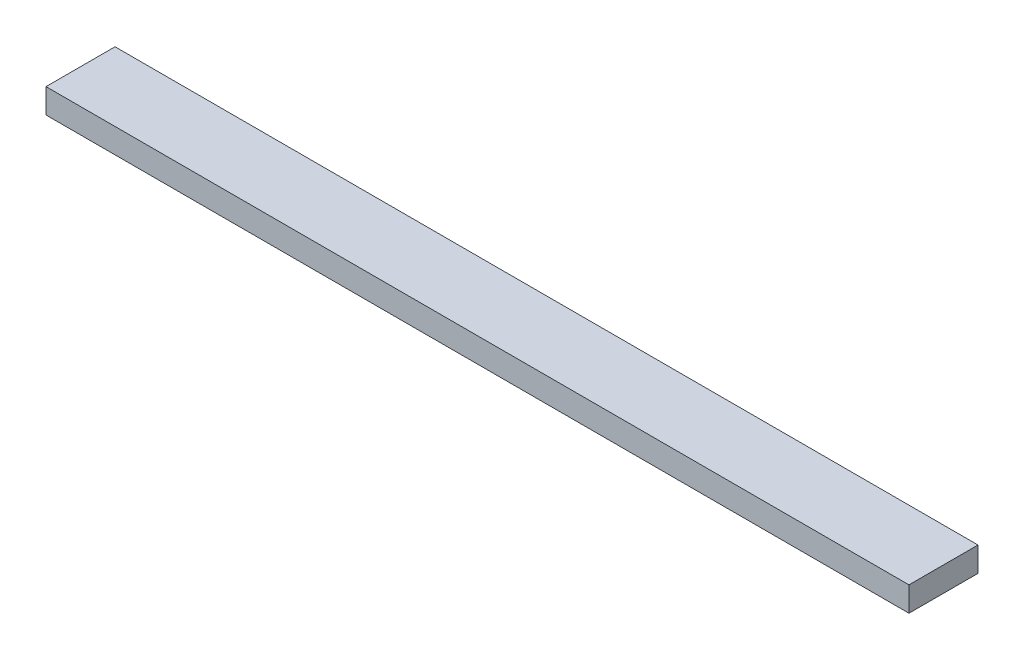
ISO-10303-21;
HEADER;
FILE_DESCRIPTION(('STEP AP214'),'2;1');
FILE_NAME('part.step','',(''),(''),'','','');
FILE_SCHEMA(('AUTOMOTIVE_DESIGN { 1 0 10303 214 1 1 1 1 }'));
ENDSEC;
DATA;
#1=APPLICATION_CONTEXT('core data for automotive mechanical design processes');
#2=APPLICATION_PROTOCOL_DEFINITION('international standard','automotive_design',2000,#1);
#3=PRODUCT_CONTEXT('',#1,'mechanical');
#4=PRODUCT('Part','Part','',(#3));
#5=PRODUCT_RELATED_PRODUCT_CATEGORY('part','',(#4));
#6=PRODUCT_DEFINITION_FORMATION('','',#4);
#7=PRODUCT_DEFINITION_CONTEXT('part definition',#1,'design');
#8=PRODUCT_DEFINITION('design','',#6,#7);
#9=PRODUCT_DEFINITION_SHAPE('','',#8);
#10=(LENGTH_UNIT() NAMED_UNIT(*) SI_UNIT(.MILLI.,.METRE.));
#11=(NAMED_UNIT(*) PLANE_ANGLE_UNIT() SI_UNIT($,.RADIAN.));
#12=(NAMED_UNIT(*) SI_UNIT($,.STERADIAN.) SOLID_ANGLE_UNIT());
#13=UNCERTAINTY_MEASURE_WITH_UNIT(LENGTH_MEASURE(1.E-05),#10,'distance_accuracy_value','');
#14=(GEOMETRIC_REPRESENTATION_CONTEXT(3) GLOBAL_UNCERTAINTY_ASSIGNED_CONTEXT((#13)) GLOBAL_UNIT_ASSIGNED_CONTEXT((#10,
#11,#12)) REPRESENTATION_CONTEXT('',''));
#15=CARTESIAN_POINT('',(0.,0.,0.));
#16=DIRECTION('',(0.,0.,1.));
#17=DIRECTION('',(1.,0.,0.));
#18=AXIS2_PLACEMENT_3D('',#15,#16,#17);
#19=CARTESIAN_POINT('',(50.,2.85,-4.));
#20=DIRECTION('',(-1.,0.,0.));
#21=DIRECTION('',(0.,0.,1.));
#22=AXIS2_PLACEMENT_3D('',#19,#20,#21);
#23=PLANE('',#22);
#24=DIRECTION('',(0.,0.,-1.));
#25=VECTOR('',#24,1.);
#26=CARTESIAN_POINT('',(50.,0.,-4.));
#27=LINE('',#26,#25);
#28=CARTESIAN_POINT('',(50.,0.,4.));
#29=VERTEX_POINT('',#28);
#30=CARTESIAN_POINT('',(50.,0.,-4.));
#31=VERTEX_POINT('',#30);
#32=EDGE_CURVE('E96',#29,#31,#27,.T.);
#33=ORIENTED_EDGE('',*,*,#32,.T.);
#34=DIRECTION('',(0.,-1.,0.));
#35=VECTOR('',#34,1.);
#36=CARTESIAN_POINT('',(50.,2.85,-4.));
#37=LINE('',#36,#35);
#38=CARTESIAN_POINT('',(50.,2.85,-4.));
#39=VERTEX_POINT('',#38);
#40=EDGE_CURVE('E11',#39,#31,#37,.T.);
#41=ORIENTED_EDGE('',*,*,#40,.F.);
#42=DIRECTION('',(0.,0.,-1.));
#43=VECTOR('',#42,1.);
#44=CARTESIAN_POINT('',(50.,2.85,-4.));
#45=LINE('',#44,#43);
#46=CARTESIAN_POINT('',(50.,2.85,4.));
#47=VERTEX_POINT('',#46);
#48=EDGE_CURVE('E84',#47,#39,#45,.T.);
#49=ORIENTED_EDGE('',*,*,#48,.F.);
#50=DIRECTION('',(0.,-1.,0.));
#51=VECTOR('',#50,1.);
#52=CARTESIAN_POINT('',(50.,2.85,4.));
#53=LINE('',#52,#51);
#54=EDGE_CURVE('E92',#47,#29,#53,.T.);
#55=ORIENTED_EDGE('',*,*,#54,.T.);
#56=EDGE_LOOP('',(#33,#41,#49,#55));
#57=FACE_BOUND('',#56,.T.);
#58=ADVANCED_FACE('F33',(#57),#23,.F.);
#59=CARTESIAN_POINT('',(-50.,2.85,-4.));
#60=DIRECTION('',(0.,0.,1.));
#61=DIRECTION('',(1.,0.,0.));
#62=AXIS2_PLACEMENT_3D('',#59,#60,#61);
#63=PLANE('',#62);
#64=DIRECTION('',(-1.,0.,0.));
#65=VECTOR('',#64,1.);
#66=CARTESIAN_POINT('',(-50.,0.,-4.));
#67=LINE('',#66,#65);
#68=CARTESIAN_POINT('',(-50.,0.,-4.));
#69=VERTEX_POINT('',#68);
#70=EDGE_CURVE('E88',#31,#69,#67,.T.);
#71=ORIENTED_EDGE('',*,*,#70,.T.);
#72=DIRECTION('',(0.,-1.,0.));
#73=VECTOR('',#72,1.);
#74=CARTESIAN_POINT('',(-50.,2.85,-4.));
#75=LINE('',#74,#73);
#76=CARTESIAN_POINT('',(-50.,2.85,-4.));
#77=VERTEX_POINT('',#76);
#78=EDGE_CURVE('E41',#77,#69,#75,.T.);
#79=ORIENTED_EDGE('',*,*,#78,.F.);
#80=DIRECTION('',(-1.,0.,0.));
#81=VECTOR('',#80,1.);
#82=CARTESIAN_POINT('',(-50.,2.85,-4.));
#83=LINE('',#82,#81);
#84=EDGE_CURVE('E79',#39,#77,#83,.T.);
#85=ORIENTED_EDGE('',*,*,#84,.F.);
#86=ORIENTED_EDGE('',*,*,#40,.T.);
#87=EDGE_LOOP('',(#71,#79,#85,#86));
#88=FACE_BOUND('',#87,.T.);
#89=ADVANCED_FACE('F87',(#88),#63,.F.);
#90=CARTESIAN_POINT('',(-50.,2.85,-4.));
#91=DIRECTION('',(1.,0.,0.));
#92=DIRECTION('',(0.,0.,-1.));
#93=AXIS2_PLACEMENT_3D('',#90,#91,#92);
#94=PLANE('',#93);
#95=DIRECTION('',(0.,0.,1.));
#96=VECTOR('',#95,1.);
#97=CARTESIAN_POINT('',(-50.,0.,-4.));
#98=LINE('',#97,#96);
#99=CARTESIAN_POINT('',(-50.,0.,4.));
#100=VERTEX_POINT('',#99);
#101=EDGE_CURVE('E66',#69,#100,#98,.T.);
#102=ORIENTED_EDGE('',*,*,#101,.T.);
#103=DIRECTION('',(0.,-1.,0.));
#104=VECTOR('',#103,1.);
#105=CARTESIAN_POINT('',(-50.,2.85,4.));
#106=LINE('',#105,#104);
#107=CARTESIAN_POINT('',(-50.,2.85,4.));
#108=VERTEX_POINT('',#107);
#109=EDGE_CURVE('E89',#108,#100,#106,.T.);
#110=ORIENTED_EDGE('',*,*,#109,.F.);
#111=DIRECTION('',(0.,0.,1.));
#112=VECTOR('',#111,1.);
#113=CARTESIAN_POINT('',(-50.,2.85,-4.));
#114=LINE('',#113,#112);
#115=EDGE_CURVE('E82',#77,#108,#114,.T.);
#116=ORIENTED_EDGE('',*,*,#115,.F.);
#117=ORIENTED_EDGE('',*,*,#78,.T.);
#118=EDGE_LOOP('',(#102,#110,#116,#117));
#119=FACE_BOUND('',#118,.T.);
#120=ADVANCED_FACE('F90',(#119),#94,.F.);
#121=CARTESIAN_POINT('',(-50.,2.85,4.));
#122=DIRECTION('',(0.,0.,-1.));
#123=DIRECTION('',(-1.,0.,0.));
#124=AXIS2_PLACEMENT_3D('',#121,#122,#123);
#125=PLANE('',#124);
#126=DIRECTION('',(1.,0.,0.));
#127=VECTOR('',#126,1.);
#128=CARTESIAN_POINT('',(-50.,0.,4.));
#129=LINE('',#128,#127);
#130=EDGE_CURVE('E72',#100,#29,#129,.T.);
#131=ORIENTED_EDGE('',*,*,#130,.T.);
#132=ORIENTED_EDGE('',*,*,#54,.F.);
#133=DIRECTION('',(1.,0.,0.));
#134=VECTOR('',#133,1.);
#135=CARTESIAN_POINT('',(-50.,2.85,4.));
#136=LINE('',#135,#134);
#137=EDGE_CURVE('E49',#108,#47,#136,.T.);
#138=ORIENTED_EDGE('',*,*,#137,.F.);
#139=ORIENTED_EDGE('',*,*,#109,.T.);
#140=EDGE_LOOP('',(#131,#132,#138,#139));
#141=FACE_BOUND('',#140,.T.);
#142=ADVANCED_FACE('F103',(#141),#125,.F.);
#143=CARTESIAN_POINT('',(0.,2.85,0.));
#144=DIRECTION('',(0.,1.,0.));
#145=DIRECTION('',(0.,0.,1.));
#146=AXIS2_PLACEMENT_3D('',#143,#144,#145);
#147=PLANE('',#146);
#148=ORIENTED_EDGE('',*,*,#48,.T.);
#149=ORIENTED_EDGE('',*,*,#84,.T.);
#150=ORIENTED_EDGE('',*,*,#115,.T.);
#151=ORIENTED_EDGE('',*,*,#137,.T.);
#152=EDGE_LOOP('',(#148,#149,#150,#151));
#153=FACE_BOUND('',#152,.T.);
#154=ADVANCED_FACE('F80',(#153),#147,.T.);
#155=CARTESIAN_POINT('',(0.,0.,0.));
#156=DIRECTION('',(0.,1.,0.));
#157=DIRECTION('',(0.,0.,1.));
#158=AXIS2_PLACEMENT_3D('',#155,#156,#157);
#159=PLANE('',#158);
#160=ORIENTED_EDGE('',*,*,#32,.F.);
#161=ORIENTED_EDGE('',*,*,#130,.F.);
#162=ORIENTED_EDGE('',*,*,#101,.F.);
#163=ORIENTED_EDGE('',*,*,#70,.F.);
#164=EDGE_LOOP('',(#160,#161,#162,#163));
#165=FACE_BOUND('',#164,.T.);
#166=ADVANCED_FACE('F106',(#165),#159,.F.);
#167=CLOSED_SHELL('',(#58,#89,#120,#142,#154,#166));
#168=MANIFOLD_SOLID_BREP('B2',#167);
#169=ADVANCED_BREP_SHAPE_REPRESENTATION('',(#18,#168),#14);
#170=SHAPE_DEFINITION_REPRESENTATION(#9,#169);
ENDSEC;
END-ISO-10303-21;
